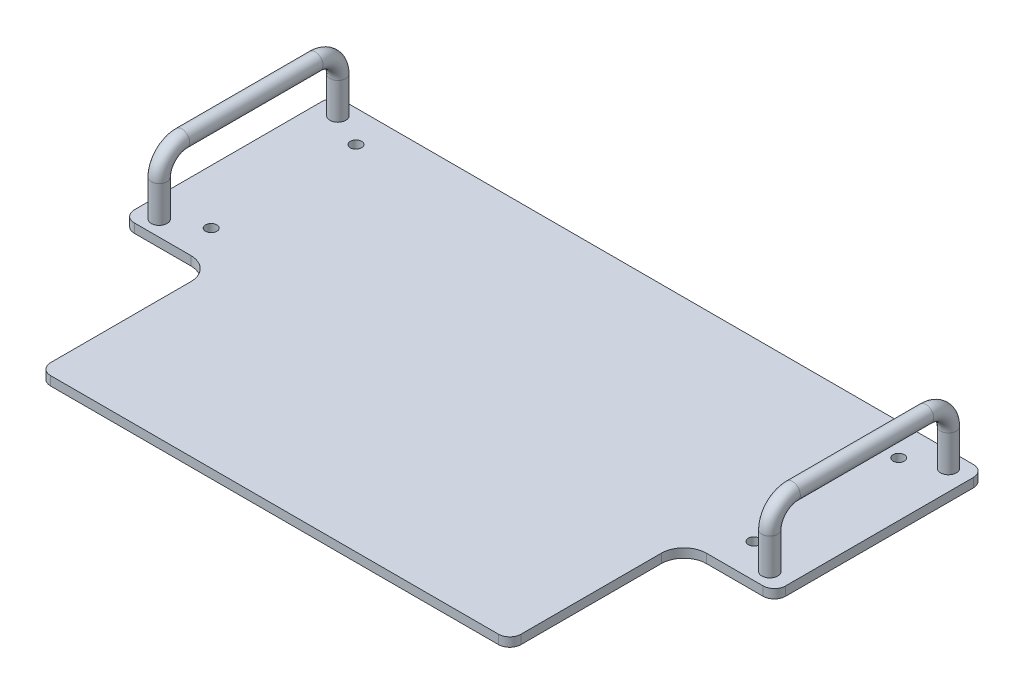
ISO-10303-21;
HEADER;
FILE_DESCRIPTION(('STEP AP214'),'2;1');
FILE_NAME('part.step','',(''),(''),'','','');
FILE_SCHEMA(('AUTOMOTIVE_DESIGN { 1 0 10303 214 1 1 1 1 }'));
ENDSEC;
DATA;
#1=APPLICATION_CONTEXT('core data for automotive mechanical design processes');
#2=APPLICATION_PROTOCOL_DEFINITION('international standard','automotive_design',2000,#1);
#3=PRODUCT_CONTEXT('',#1,'mechanical');
#4=PRODUCT('Part','Part','',(#3));
#5=PRODUCT_RELATED_PRODUCT_CATEGORY('part','',(#4));
#6=PRODUCT_DEFINITION_FORMATION('','',#4);
#7=PRODUCT_DEFINITION_CONTEXT('part definition',#1,'design');
#8=PRODUCT_DEFINITION('design','',#6,#7);
#9=PRODUCT_DEFINITION_SHAPE('','',#8);
#10=(LENGTH_UNIT() NAMED_UNIT(*) SI_UNIT(.MILLI.,.METRE.));
#11=(NAMED_UNIT(*) PLANE_ANGLE_UNIT() SI_UNIT($,.RADIAN.));
#12=(NAMED_UNIT(*) SI_UNIT($,.STERADIAN.) SOLID_ANGLE_UNIT());
#13=UNCERTAINTY_MEASURE_WITH_UNIT(LENGTH_MEASURE(1.E-05),#10,'distance_accuracy_value','');
#14=(GEOMETRIC_REPRESENTATION_CONTEXT(3) GLOBAL_UNCERTAINTY_ASSIGNED_CONTEXT((#13)) GLOBAL_UNIT_ASSIGNED_CONTEXT((#10,
#11,#12)) REPRESENTATION_CONTEXT('',''));
#15=CARTESIAN_POINT('',(0.,0.,0.));
#16=DIRECTION('',(0.,0.,1.));
#17=DIRECTION('',(1.,0.,0.));
#18=AXIS2_PLACEMENT_3D('',#15,#16,#17);
#19=CARTESIAN_POINT('',(-35.,4.,-165.));
#20=DIRECTION('',(0.,-1.,0.));
#21=DIRECTION('',(0.,0.,-1.));
#22=AXIS2_PLACEMENT_3D('',#19,#20,#21);
#23=CYLINDRICAL_SURFACE('',#22,5.);
#24=CARTESIAN_POINT('',(-35.,0.,-165.));
#25=DIRECTION('',(0.,-1.,0.));
#26=DIRECTION('',(0.,0.,-1.));
#27=AXIS2_PLACEMENT_3D('',#24,#25,#26);
#28=CIRCLE('',#27,5.);
#29=CARTESIAN_POINT('',(-40.,0.,-165.));
#30=VERTEX_POINT('',#29);
#31=CARTESIAN_POINT('',(-35.,0.,-170.));
#32=VERTEX_POINT('',#31);
#33=EDGE_CURVE('E206',#30,#32,#28,.T.);
#34=ORIENTED_EDGE('',*,*,#33,.F.);
#35=DIRECTION('',(0.,-1.,0.));
#36=VECTOR('',#35,1.);
#37=CARTESIAN_POINT('',(-40.,4.,-165.));
#38=LINE('',#37,#36);
#39=CARTESIAN_POINT('',(-40.,4.,-165.));
#40=VERTEX_POINT('',#39);
#41=EDGE_CURVE('E75',#40,#30,#38,.T.);
#42=ORIENTED_EDGE('',*,*,#41,.F.);
#43=CARTESIAN_POINT('',(-35.,4.,-165.));
#44=DIRECTION('',(0.,-1.,0.));
#45=DIRECTION('',(0.,0.,-1.));
#46=AXIS2_PLACEMENT_3D('',#43,#44,#45);
#47=CIRCLE('',#46,5.);
#48=CARTESIAN_POINT('',(-35.,4.,-170.));
#49=VERTEX_POINT('',#48);
#50=EDGE_CURVE('E245',#40,#49,#47,.T.);
#51=ORIENTED_EDGE('',*,*,#50,.T.);
#52=DIRECTION('',(0.,-1.,0.));
#53=VECTOR('',#52,1.);
#54=CARTESIAN_POINT('',(-35.,4.,-170.));
#55=LINE('',#54,#53);
#56=EDGE_CURVE('E140',#49,#32,#55,.T.);
#57=ORIENTED_EDGE('',*,*,#56,.T.);
#58=EDGE_LOOP('',(#34,#42,#51,#57));
#59=FACE_BOUND('',#58,.T.);
#60=ADVANCED_FACE('F57',(#59),#23,.T.);
#61=CARTESIAN_POINT('',(-40.,4.,-82.));
#62=DIRECTION('',(-1.,0.,0.));
#63=DIRECTION('',(0.,0.,1.));
#64=AXIS2_PLACEMENT_3D('',#61,#62,#63);
#65=PLANE('',#64);
#66=DIRECTION('',(0.,0.,-1.));
#67=VECTOR('',#66,1.);
#68=CARTESIAN_POINT('',(-40.,0.,-82.));
#69=LINE('',#68,#67);
#70=CARTESIAN_POINT('',(-40.,0.,-82.));
#71=VERTEX_POINT('',#70);
#72=EDGE_CURVE('E242',#71,#30,#69,.T.);
#73=ORIENTED_EDGE('',*,*,#72,.F.);
#74=DIRECTION('',(0.,-1.,0.));
#75=VECTOR('',#74,1.);
#76=CARTESIAN_POINT('',(-40.,4.,-82.));
#77=LINE('',#76,#75);
#78=CARTESIAN_POINT('',(-40.,4.,-82.));
#79=VERTEX_POINT('',#78);
#80=EDGE_CURVE('E128',#79,#71,#77,.T.);
#81=ORIENTED_EDGE('',*,*,#80,.F.);
#82=DIRECTION('',(0.,0.,-1.));
#83=VECTOR('',#82,1.);
#84=CARTESIAN_POINT('',(-40.,4.,-82.));
#85=LINE('',#84,#83);
#86=EDGE_CURVE('E196',#79,#40,#85,.T.);
#87=ORIENTED_EDGE('',*,*,#86,.T.);
#88=ORIENTED_EDGE('',*,*,#41,.T.);
#89=EDGE_LOOP('',(#73,#81,#87,#88));
#90=FACE_BOUND('',#89,.T.);
#91=ADVANCED_FACE('F415',(#90),#65,.T.);
#92=CARTESIAN_POINT('',(-35.,4.,-82.));
#93=DIRECTION('',(0.,-1.,0.));
#94=DIRECTION('',(0.,0.,-1.));
#95=AXIS2_PLACEMENT_3D('',#92,#93,#94);
#96=CYLINDRICAL_SURFACE('',#95,5.);
#97=CARTESIAN_POINT('',(-35.,0.,-82.));
#98=DIRECTION('',(0.,-1.,0.));
#99=DIRECTION('',(0.,0.,-1.));
#100=AXIS2_PLACEMENT_3D('',#97,#98,#99);
#101=CIRCLE('',#100,5.);
#102=CARTESIAN_POINT('',(-35.,0.,-77.));
#103=VERTEX_POINT('',#102);
#104=EDGE_CURVE('E183',#103,#71,#101,.T.);
#105=ORIENTED_EDGE('',*,*,#104,.F.);
#106=DIRECTION('',(0.,-1.,0.));
#107=VECTOR('',#106,1.);
#108=CARTESIAN_POINT('',(-35.,4.,-77.));
#109=LINE('',#108,#107);
#110=CARTESIAN_POINT('',(-35.,4.,-77.));
#111=VERTEX_POINT('',#110);
#112=EDGE_CURVE('E178',#111,#103,#109,.T.);
#113=ORIENTED_EDGE('',*,*,#112,.F.);
#114=CARTESIAN_POINT('',(-35.,4.,-82.));
#115=DIRECTION('',(0.,-1.,0.));
#116=DIRECTION('',(0.,0.,-1.));
#117=AXIS2_PLACEMENT_3D('',#114,#115,#116);
#118=CIRCLE('',#117,5.);
#119=EDGE_CURVE('E181',#111,#79,#118,.T.);
#120=ORIENTED_EDGE('',*,*,#119,.T.);
#121=ORIENTED_EDGE('',*,*,#80,.T.);
#122=EDGE_LOOP('',(#105,#113,#120,#121));
#123=FACE_BOUND('',#122,.T.);
#124=ADVANCED_FACE('F180',(#123),#96,.T.);
#125=CARTESIAN_POINT('',(-10.,4.,-77.));
#126=DIRECTION('',(0.,0.,1.));
#127=DIRECTION('',(1.,0.,0.));
#128=AXIS2_PLACEMENT_3D('',#125,#126,#127);
#129=PLANE('',#128);
#130=DIRECTION('',(-1.,0.,0.));
#131=VECTOR('',#130,1.);
#132=CARTESIAN_POINT('',(-10.,0.,-77.));
#133=LINE('',#132,#131);
#134=CARTESIAN_POINT('',(-10.,0.,-77.));
#135=VERTEX_POINT('',#134);
#136=EDGE_CURVE('E239',#135,#103,#133,.T.);
#137=ORIENTED_EDGE('',*,*,#136,.F.);
#138=DIRECTION('',(0.,-1.,0.));
#139=VECTOR('',#138,1.);
#140=CARTESIAN_POINT('',(-10.,4.,-77.));
#141=LINE('',#140,#139);
#142=CARTESIAN_POINT('',(-10.,4.,-77.));
#143=VERTEX_POINT('',#142);
#144=EDGE_CURVE('E188',#143,#135,#141,.T.);
#145=ORIENTED_EDGE('',*,*,#144,.F.);
#146=DIRECTION('',(-1.,0.,0.));
#147=VECTOR('',#146,1.);
#148=CARTESIAN_POINT('',(-10.,4.,-77.));
#149=LINE('',#148,#147);
#150=EDGE_CURVE('E194',#143,#111,#149,.T.);
#151=ORIENTED_EDGE('',*,*,#150,.T.);
#152=ORIENTED_EDGE('',*,*,#112,.T.);
#153=EDGE_LOOP('',(#137,#145,#151,#152));
#154=FACE_BOUND('',#153,.T.);
#155=ADVANCED_FACE('F198',(#154),#129,.T.);
#156=CARTESIAN_POINT('',(-10.,4.,-67.));
#157=DIRECTION('',(0.,-1.,0.));
#158=DIRECTION('',(0.,0.,-1.));
#159=AXIS2_PLACEMENT_3D('',#156,#157,#158);
#160=CYLINDRICAL_SURFACE('',#159,10.);
#161=CARTESIAN_POINT('',(-10.,0.,-67.));
#162=DIRECTION('',(0.,1.,0.));
#163=DIRECTION('',(0.,0.,1.));
#164=AXIS2_PLACEMENT_3D('',#161,#162,#163);
#165=CIRCLE('',#164,10.);
#166=CARTESIAN_POINT('',(0.,0.,-67.));
#167=VERTEX_POINT('',#166);
#168=EDGE_CURVE('E236',#167,#135,#165,.T.);
#169=ORIENTED_EDGE('',*,*,#168,.F.);
#170=DIRECTION('',(0.,-1.,0.));
#171=VECTOR('',#170,1.);
#172=CARTESIAN_POINT('',(0.,4.,-67.));
#173=LINE('',#172,#171);
#174=CARTESIAN_POINT('',(0.,4.,-67.));
#175=VERTEX_POINT('',#174);
#176=EDGE_CURVE('E250',#175,#167,#173,.T.);
#177=ORIENTED_EDGE('',*,*,#176,.F.);
#178=CARTESIAN_POINT('',(-10.,4.,-67.));
#179=DIRECTION('',(0.,1.,0.));
#180=DIRECTION('',(0.,0.,1.));
#181=AXIS2_PLACEMENT_3D('',#178,#179,#180);
#182=CIRCLE('',#181,10.);
#183=EDGE_CURVE('E199',#175,#143,#182,.T.);
#184=ORIENTED_EDGE('',*,*,#183,.T.);
#185=ORIENTED_EDGE('',*,*,#144,.T.);
#186=EDGE_LOOP('',(#169,#177,#184,#185));
#187=FACE_BOUND('',#186,.T.);
#188=ADVANCED_FACE('F422',(#187),#160,.F.);
#189=CARTESIAN_POINT('',(0.,4.,-5.));
#190=DIRECTION('',(-1.,0.,0.));
#191=DIRECTION('',(0.,0.,1.));
#192=AXIS2_PLACEMENT_3D('',#189,#190,#191);
#193=PLANE('',#192);
#194=DIRECTION('',(0.,0.,-1.));
#195=VECTOR('',#194,1.);
#196=CARTESIAN_POINT('',(0.,0.,-5.));
#197=LINE('',#196,#195);
#198=CARTESIAN_POINT('',(0.,0.,-5.));
#199=VERTEX_POINT('',#198);
#200=EDGE_CURVE('E233',#199,#167,#197,.T.);
#201=ORIENTED_EDGE('',*,*,#200,.F.);
#202=DIRECTION('',(0.,-1.,0.));
#203=VECTOR('',#202,1.);
#204=CARTESIAN_POINT('',(0.,4.,-5.));
#205=LINE('',#204,#203);
#206=CARTESIAN_POINT('',(0.,4.,-5.));
#207=VERTEX_POINT('',#206);
#208=EDGE_CURVE('E252',#207,#199,#205,.T.);
#209=ORIENTED_EDGE('',*,*,#208,.F.);
#210=DIRECTION('',(0.,0.,-1.));
#211=VECTOR('',#210,1.);
#212=CARTESIAN_POINT('',(0.,4.,-5.));
#213=LINE('',#212,#211);
#214=EDGE_CURVE('E201',#207,#175,#213,.T.);
#215=ORIENTED_EDGE('',*,*,#214,.T.);
#216=ORIENTED_EDGE('',*,*,#176,.T.);
#217=EDGE_LOOP('',(#201,#209,#215,#216));
#218=FACE_BOUND('',#217,.T.);
#219=ADVANCED_FACE('F357',(#218),#193,.T.);
#220=CARTESIAN_POINT('',(5.,4.,-5.));
#221=DIRECTION('',(0.,-1.,0.));
#222=DIRECTION('',(0.,0.,-1.));
#223=AXIS2_PLACEMENT_3D('',#220,#221,#222);
#224=CYLINDRICAL_SURFACE('',#223,5.);
#225=CARTESIAN_POINT('',(5.,0.,-5.));
#226=DIRECTION('',(0.,-1.,0.));
#227=DIRECTION('',(0.,0.,-1.));
#228=AXIS2_PLACEMENT_3D('',#225,#226,#227);
#229=CIRCLE('',#228,5.);
#230=CARTESIAN_POINT('',(5.,0.,0.));
#231=VERTEX_POINT('',#230);
#232=EDGE_CURVE('E230',#231,#199,#229,.T.);
#233=ORIENTED_EDGE('',*,*,#232,.F.);
#234=DIRECTION('',(0.,-1.,0.));
#235=VECTOR('',#234,1.);
#236=CARTESIAN_POINT('',(5.,4.,0.));
#237=LINE('',#236,#235);
#238=CARTESIAN_POINT('',(5.,4.,0.));
#239=VERTEX_POINT('',#238);
#240=EDGE_CURVE('E254',#239,#231,#237,.T.);
#241=ORIENTED_EDGE('',*,*,#240,.F.);
#242=CARTESIAN_POINT('',(5.,4.,-5.));
#243=DIRECTION('',(0.,-1.,0.));
#244=DIRECTION('',(0.,0.,-1.));
#245=AXIS2_PLACEMENT_3D('',#242,#243,#244);
#246=CIRCLE('',#245,5.);
#247=EDGE_CURVE('E351',#239,#207,#246,.T.);
#248=ORIENTED_EDGE('',*,*,#247,.T.);
#249=ORIENTED_EDGE('',*,*,#208,.T.);
#250=EDGE_LOOP('',(#233,#241,#248,#249));
#251=FACE_BOUND('',#250,.T.);
#252=ADVANCED_FACE('F362',(#251),#224,.T.);
#253=CARTESIAN_POINT('',(5.,4.,0.));
#254=DIRECTION('',(0.,0.,-1.));
#255=DIRECTION('',(-1.,0.,0.));
#256=AXIS2_PLACEMENT_3D('',#253,#254,#255);
#257=PLANE('',#256);
#258=DIRECTION('',(1.,0.,0.));
#259=VECTOR('',#258,1.);
#260=CARTESIAN_POINT('',(5.,0.,0.));
#261=LINE('',#260,#259);
#262=CARTESIAN_POINT('',(203.,0.,0.));
#263=VERTEX_POINT('',#262);
#264=EDGE_CURVE('E228',#231,#263,#261,.T.);
#265=ORIENTED_EDGE('',*,*,#264,.T.);
#266=DIRECTION('',(0.,-1.,0.));
#267=VECTOR('',#266,1.);
#268=CARTESIAN_POINT('',(203.,4.,0.));
#269=LINE('',#268,#267);
#270=CARTESIAN_POINT('',(203.,4.,0.));
#271=VERTEX_POINT('',#270);
#272=EDGE_CURVE('E256',#271,#263,#269,.T.);
#273=ORIENTED_EDGE('',*,*,#272,.F.);
#274=DIRECTION('',(1.,0.,0.));
#275=VECTOR('',#274,1.);
#276=CARTESIAN_POINT('',(5.,4.,0.));
#277=LINE('',#276,#275);
#278=EDGE_CURVE('E349',#239,#271,#277,.T.);
#279=ORIENTED_EDGE('',*,*,#278,.F.);
#280=ORIENTED_EDGE('',*,*,#240,.T.);
#281=EDGE_LOOP('',(#265,#273,#279,#280));
#282=FACE_BOUND('',#281,.T.);
#283=ADVANCED_FACE('F367',(#282),#257,.F.);
#284=CARTESIAN_POINT('',(203.,4.,-5.));
#285=DIRECTION('',(0.,-1.,0.));
#286=DIRECTION('',(0.,0.,-1.));
#287=AXIS2_PLACEMENT_3D('',#284,#285,#286);
#288=CYLINDRICAL_SURFACE('',#287,5.);
#289=CARTESIAN_POINT('',(203.,0.,-5.));
#290=DIRECTION('',(0.,1.,0.));
#291=DIRECTION('',(0.,0.,1.));
#292=AXIS2_PLACEMENT_3D('',#289,#290,#291);
#293=CIRCLE('',#292,5.);
#294=CARTESIAN_POINT('',(208.,0.,-5.));
#295=VERTEX_POINT('',#294);
#296=EDGE_CURVE('E226',#263,#295,#293,.T.);
#297=ORIENTED_EDGE('',*,*,#296,.T.);
#298=DIRECTION('',(0.,-1.,0.));
#299=VECTOR('',#298,1.);
#300=CARTESIAN_POINT('',(208.,4.,-5.));
#301=LINE('',#300,#299);
#302=CARTESIAN_POINT('',(208.,4.,-5.));
#303=VERTEX_POINT('',#302);
#304=EDGE_CURVE('E259',#303,#295,#301,.T.);
#305=ORIENTED_EDGE('',*,*,#304,.F.);
#306=CARTESIAN_POINT('',(203.,4.,-5.));
#307=DIRECTION('',(0.,1.,0.));
#308=DIRECTION('',(0.,0.,1.));
#309=AXIS2_PLACEMENT_3D('',#306,#307,#308);
#310=CIRCLE('',#309,5.);
#311=EDGE_CURVE('E347',#271,#303,#310,.T.);
#312=ORIENTED_EDGE('',*,*,#311,.F.);
#313=ORIENTED_EDGE('',*,*,#272,.T.);
#314=EDGE_LOOP('',(#297,#305,#312,#313));
#315=FACE_BOUND('',#314,.T.);
#316=ADVANCED_FACE('F373',(#315),#288,.T.);
#317=CARTESIAN_POINT('',(208.,4.,-5.));
#318=DIRECTION('',(-1.,0.,0.));
#319=DIRECTION('',(0.,0.,1.));
#320=AXIS2_PLACEMENT_3D('',#317,#318,#319);
#321=PLANE('',#320);
#322=DIRECTION('',(0.,0.,-1.));
#323=VECTOR('',#322,1.);
#324=CARTESIAN_POINT('',(208.,0.,-5.));
#325=LINE('',#324,#323);
#326=CARTESIAN_POINT('',(208.,0.,-67.));
#327=VERTEX_POINT('',#326);
#328=EDGE_CURVE('E224',#295,#327,#325,.T.);
#329=ORIENTED_EDGE('',*,*,#328,.T.);
#330=DIRECTION('',(0.,-1.,0.));
#331=VECTOR('',#330,1.);
#332=CARTESIAN_POINT('',(208.,4.,-67.));
#333=LINE('',#332,#331);
#334=CARTESIAN_POINT('',(208.,4.,-67.));
#335=VERTEX_POINT('',#334);
#336=EDGE_CURVE('E262',#335,#327,#333,.T.);
#337=ORIENTED_EDGE('',*,*,#336,.F.);
#338=DIRECTION('',(0.,0.,-1.));
#339=VECTOR('',#338,1.);
#340=CARTESIAN_POINT('',(208.,4.,-5.));
#341=LINE('',#340,#339);
#342=EDGE_CURVE('E345',#303,#335,#341,.T.);
#343=ORIENTED_EDGE('',*,*,#342,.F.);
#344=ORIENTED_EDGE('',*,*,#304,.T.);
#345=EDGE_LOOP('',(#329,#337,#343,#344));
#346=FACE_BOUND('',#345,.T.);
#347=ADVANCED_FACE('F377',(#346),#321,.F.);
#348=CARTESIAN_POINT('',(218.,4.,-67.));
#349=DIRECTION('',(0.,-1.,0.));
#350=DIRECTION('',(0.,0.,-1.));
#351=AXIS2_PLACEMENT_3D('',#348,#349,#350);
#352=CYLINDRICAL_SURFACE('',#351,9.99999999999999);
#353=CARTESIAN_POINT('',(218.,0.,-67.));
#354=DIRECTION('',(0.,-1.,0.));
#355=DIRECTION('',(0.,0.,-1.));
#356=AXIS2_PLACEMENT_3D('',#353,#354,#355);
#357=CIRCLE('',#356,9.99999999999999);
#358=CARTESIAN_POINT('',(218.,0.,-77.));
#359=VERTEX_POINT('',#358);
#360=EDGE_CURVE('E222',#327,#359,#357,.T.);
#361=ORIENTED_EDGE('',*,*,#360,.T.);
#362=DIRECTION('',(0.,-1.,0.));
#363=VECTOR('',#362,1.);
#364=CARTESIAN_POINT('',(218.,4.,-77.));
#365=LINE('',#364,#363);
#366=CARTESIAN_POINT('',(218.,4.,-77.));
#367=VERTEX_POINT('',#366);
#368=EDGE_CURVE('E265',#367,#359,#365,.T.);
#369=ORIENTED_EDGE('',*,*,#368,.F.);
#370=CARTESIAN_POINT('',(218.,4.,-67.));
#371=DIRECTION('',(0.,-1.,0.));
#372=DIRECTION('',(0.,0.,-1.));
#373=AXIS2_PLACEMENT_3D('',#370,#371,#372);
#374=CIRCLE('',#373,9.99999999999999);
#375=EDGE_CURVE('E343',#335,#367,#374,.T.);
#376=ORIENTED_EDGE('',*,*,#375,.F.);
#377=ORIENTED_EDGE('',*,*,#336,.T.);
#378=EDGE_LOOP('',(#361,#369,#376,#377));
#379=FACE_BOUND('',#378,.T.);
#380=ADVANCED_FACE('F382',(#379),#352,.F.);
#381=CARTESIAN_POINT('',(218.,4.,-77.));
#382=DIRECTION('',(0.,0.,-1.));
#383=DIRECTION('',(-1.,0.,0.));
#384=AXIS2_PLACEMENT_3D('',#381,#382,#383);
#385=PLANE('',#384);
#386=DIRECTION('',(1.,0.,0.));
#387=VECTOR('',#386,1.);
#388=CARTESIAN_POINT('',(218.,0.,-77.));
#389=LINE('',#388,#387);
#390=CARTESIAN_POINT('',(243.,0.,-77.));
#391=VERTEX_POINT('',#390);
#392=EDGE_CURVE('E220',#359,#391,#389,.T.);
#393=ORIENTED_EDGE('',*,*,#392,.T.);
#394=DIRECTION('',(0.,-1.,0.));
#395=VECTOR('',#394,1.);
#396=CARTESIAN_POINT('',(243.,4.,-77.));
#397=LINE('',#396,#395);
#398=CARTESIAN_POINT('',(243.,4.,-77.));
#399=VERTEX_POINT('',#398);
#400=EDGE_CURVE('E268',#399,#391,#397,.T.);
#401=ORIENTED_EDGE('',*,*,#400,.F.);
#402=DIRECTION('',(1.,0.,0.));
#403=VECTOR('',#402,1.);
#404=CARTESIAN_POINT('',(218.,4.,-77.));
#405=LINE('',#404,#403);
#406=EDGE_CURVE('E341',#367,#399,#405,.T.);
#407=ORIENTED_EDGE('',*,*,#406,.F.);
#408=ORIENTED_EDGE('',*,*,#368,.T.);
#409=EDGE_LOOP('',(#393,#401,#407,#408));
#410=FACE_BOUND('',#409,.T.);
#411=ADVANCED_FACE('F388',(#410),#385,.F.);
#412=CARTESIAN_POINT('',(243.,4.,-82.));
#413=DIRECTION('',(0.,-1.,0.));
#414=DIRECTION('',(0.,0.,-1.));
#415=AXIS2_PLACEMENT_3D('',#412,#413,#414);
#416=CYLINDRICAL_SURFACE('',#415,5.);
#417=CARTESIAN_POINT('',(243.,0.,-82.));
#418=DIRECTION('',(0.,1.,0.));
#419=DIRECTION('',(0.,0.,1.));
#420=AXIS2_PLACEMENT_3D('',#417,#418,#419);
#421=CIRCLE('',#420,5.);
#422=CARTESIAN_POINT('',(248.,0.,-82.));
#423=VERTEX_POINT('',#422);
#424=EDGE_CURVE('E218',#391,#423,#421,.T.);
#425=ORIENTED_EDGE('',*,*,#424,.T.);
#426=DIRECTION('',(0.,-1.,0.));
#427=VECTOR('',#426,1.);
#428=CARTESIAN_POINT('',(248.,4.,-82.));
#429=LINE('',#428,#427);
#430=CARTESIAN_POINT('',(248.,4.,-82.));
#431=VERTEX_POINT('',#430);
#432=EDGE_CURVE('E271',#431,#423,#429,.T.);
#433=ORIENTED_EDGE('',*,*,#432,.F.);
#434=CARTESIAN_POINT('',(243.,4.,-82.));
#435=DIRECTION('',(0.,1.,0.));
#436=DIRECTION('',(0.,0.,1.));
#437=AXIS2_PLACEMENT_3D('',#434,#435,#436);
#438=CIRCLE('',#437,5.);
#439=EDGE_CURVE('E339',#399,#431,#438,.T.);
#440=ORIENTED_EDGE('',*,*,#439,.F.);
#441=ORIENTED_EDGE('',*,*,#400,.T.);
#442=EDGE_LOOP('',(#425,#433,#440,#441));
#443=FACE_BOUND('',#442,.T.);
#444=ADVANCED_FACE('F392',(#443),#416,.T.);
#445=CARTESIAN_POINT('',(248.,4.,-82.));
#446=DIRECTION('',(-1.,0.,0.));
#447=DIRECTION('',(0.,0.,1.));
#448=AXIS2_PLACEMENT_3D('',#445,#446,#447);
#449=PLANE('',#448);
#450=DIRECTION('',(0.,0.,-1.));
#451=VECTOR('',#450,1.);
#452=CARTESIAN_POINT('',(248.,0.,-82.));
#453=LINE('',#452,#451);
#454=CARTESIAN_POINT('',(248.,0.,-165.));
#455=VERTEX_POINT('',#454);
#456=EDGE_CURVE('E216',#423,#455,#453,.T.);
#457=ORIENTED_EDGE('',*,*,#456,.T.);
#458=DIRECTION('',(0.,-1.,0.));
#459=VECTOR('',#458,1.);
#460=CARTESIAN_POINT('',(248.,4.,-165.));
#461=LINE('',#460,#459);
#462=CARTESIAN_POINT('',(248.,4.,-165.));
#463=VERTEX_POINT('',#462);
#464=EDGE_CURVE('E274',#463,#455,#461,.T.);
#465=ORIENTED_EDGE('',*,*,#464,.F.);
#466=DIRECTION('',(0.,0.,-1.));
#467=VECTOR('',#466,1.);
#468=CARTESIAN_POINT('',(248.,4.,-82.));
#469=LINE('',#468,#467);
#470=EDGE_CURVE('E337',#431,#463,#469,.T.);
#471=ORIENTED_EDGE('',*,*,#470,.F.);
#472=ORIENTED_EDGE('',*,*,#432,.T.);
#473=EDGE_LOOP('',(#457,#465,#471,#472));
#474=FACE_BOUND('',#473,.T.);
#475=ADVANCED_FACE('F397',(#474),#449,.F.);
#476=CARTESIAN_POINT('',(243.,4.,-165.));
#477=DIRECTION('',(0.,-1.,0.));
#478=DIRECTION('',(0.,0.,-1.));
#479=AXIS2_PLACEMENT_3D('',#476,#477,#478);
#480=CYLINDRICAL_SURFACE('',#479,5.);
#481=CARTESIAN_POINT('',(243.,0.,-165.));
#482=DIRECTION('',(0.,1.,0.));
#483=DIRECTION('',(0.,0.,1.));
#484=AXIS2_PLACEMENT_3D('',#481,#482,#483);
#485=CIRCLE('',#484,5.);
#486=CARTESIAN_POINT('',(243.,0.,-170.));
#487=VERTEX_POINT('',#486);
#488=EDGE_CURVE('E213',#455,#487,#485,.T.);
#489=ORIENTED_EDGE('',*,*,#488,.T.);
#490=DIRECTION('',(0.,-1.,0.));
#491=VECTOR('',#490,1.);
#492=CARTESIAN_POINT('',(243.,4.,-170.));
#493=LINE('',#492,#491);
#494=CARTESIAN_POINT('',(243.,4.,-170.));
#495=VERTEX_POINT('',#494);
#496=EDGE_CURVE('E277',#495,#487,#493,.T.);
#497=ORIENTED_EDGE('',*,*,#496,.F.);
#498=CARTESIAN_POINT('',(243.,4.,-165.));
#499=DIRECTION('',(0.,1.,0.));
#500=DIRECTION('',(0.,0.,1.));
#501=AXIS2_PLACEMENT_3D('',#498,#499,#500);
#502=CIRCLE('',#501,5.);
#503=EDGE_CURVE('E335',#463,#495,#502,.T.);
#504=ORIENTED_EDGE('',*,*,#503,.F.);
#505=ORIENTED_EDGE('',*,*,#464,.T.);
#506=EDGE_LOOP('',(#489,#497,#504,#505));
#507=FACE_BOUND('',#506,.T.);
#508=ADVANCED_FACE('F401',(#507),#480,.T.);
#509=CARTESIAN_POINT('',(-35.,4.,-170.));
#510=DIRECTION('',(0.,0.,-1.));
#511=DIRECTION('',(-1.,0.,0.));
#512=AXIS2_PLACEMENT_3D('',#509,#510,#511);
#513=PLANE('',#512);
#514=DIRECTION('',(1.,0.,0.));
#515=VECTOR('',#514,1.);
#516=CARTESIAN_POINT('',(-35.,0.,-170.));
#517=LINE('',#516,#515);
#518=EDGE_CURVE('E209',#32,#487,#517,.T.);
#519=ORIENTED_EDGE('',*,*,#518,.F.);
#520=ORIENTED_EDGE('',*,*,#56,.F.);
#521=DIRECTION('',(1.,0.,0.));
#522=VECTOR('',#521,1.);
#523=CARTESIAN_POINT('',(-35.,4.,-170.));
#524=LINE('',#523,#522);
#525=EDGE_CURVE('E333',#49,#495,#524,.T.);
#526=ORIENTED_EDGE('',*,*,#525,.T.);
#527=ORIENTED_EDGE('',*,*,#496,.T.);
#528=EDGE_LOOP('',(#519,#520,#526,#527));
#529=FACE_BOUND('',#528,.T.);
#530=ADVANCED_FACE('F403',(#529),#513,.T.);
#531=CARTESIAN_POINT('',(-35.,4.,-165.));
#532=DIRECTION('',(0.,-1.,0.));
#533=DIRECTION('',(0.,0.,-1.));
#534=AXIS2_PLACEMENT_3D('',#531,#532,#533);
#535=PLANE('',#534);
#536=CARTESIAN_POINT('',(224.,4.,-156.));
#537=DIRECTION('',(0.,1.,0.));
#538=DIRECTION('',(0.,0.,1.));
#539=AXIS2_PLACEMENT_3D('',#536,#537,#538);
#540=CIRCLE('',#539,2.5);
#541=CARTESIAN_POINT('',(224.,4.,-153.5));
#542=VERTEX_POINT('',#541);
#543=EDGE_CURVE('E295',#542,#542,#540,.T.);
#544=ORIENTED_EDGE('',*,*,#543,.F.);
#545=EDGE_LOOP('',(#544));
#546=FACE_BOUND('',#545,.T.);
#547=CARTESIAN_POINT('',(-16.,4.,-92.));
#548=DIRECTION('',(0.,1.,0.));
#549=DIRECTION('',(0.,0.,1.));
#550=AXIS2_PLACEMENT_3D('',#547,#548,#549);
#551=CIRCLE('',#550,2.5);
#552=CARTESIAN_POINT('',(-16.,4.,-89.5));
#553=VERTEX_POINT('',#552);
#554=EDGE_CURVE('E690',#553,#553,#551,.T.);
#555=ORIENTED_EDGE('',*,*,#554,.F.);
#556=EDGE_LOOP('',(#555));
#557=FACE_BOUND('',#556,.T.);
#558=CARTESIAN_POINT('',(224.,4.,-92.));
#559=DIRECTION('',(0.,1.,0.));
#560=DIRECTION('',(0.,0.,1.));
#561=AXIS2_PLACEMENT_3D('',#558,#559,#560);
#562=CIRCLE('',#561,2.5);
#563=CARTESIAN_POINT('',(224.,4.,-89.5));
#564=VERTEX_POINT('',#563);
#565=EDGE_CURVE('E308',#564,#564,#562,.T.);
#566=ORIENTED_EDGE('',*,*,#565,.F.);
#567=EDGE_LOOP('',(#566));
#568=FACE_BOUND('',#567,.T.);
#569=CARTESIAN_POINT('',(-16.,4.,-156.));
#570=DIRECTION('',(0.,1.,0.));
#571=DIRECTION('',(0.,0.,1.));
#572=AXIS2_PLACEMENT_3D('',#569,#570,#571);
#573=CIRCLE('',#572,2.5);
#574=CARTESIAN_POINT('',(-16.,4.,-153.5));
#575=VERTEX_POINT('',#574);
#576=EDGE_CURVE('E291',#575,#575,#573,.T.);
#577=ORIENTED_EDGE('',*,*,#576,.F.);
#578=EDGE_LOOP('',(#577));
#579=FACE_BOUND('',#578,.T.);
#580=CARTESIAN_POINT('',(-31.,4.,-163.));
#581=DIRECTION('',(0.,-1.,0.));
#582=DIRECTION('',(0.,0.,-1.));
#583=AXIS2_PLACEMENT_3D('',#580,#581,#582);
#584=CIRCLE('',#583,3.5);
#585=CARTESIAN_POINT('',(-31.,4.,-166.5));
#586=VERTEX_POINT('',#585);
#587=EDGE_CURVE('E12',#586,#586,#584,.F.);
#588=ORIENTED_EDGE('',*,*,#587,.F.);
#589=EDGE_LOOP('',(#588));
#590=FACE_BOUND('',#589,.T.);
#591=CARTESIAN_POINT('',(-31.,4.,-84.));
#592=DIRECTION('',(0.,-1.,0.));
#593=DIRECTION('',(0.,0.,-1.));
#594=AXIS2_PLACEMENT_3D('',#591,#592,#593);
#595=CIRCLE('',#594,3.5);
#596=CARTESIAN_POINT('',(-31.,4.,-87.5));
#597=VERTEX_POINT('',#596);
#598=EDGE_CURVE('E66',#597,#597,#595,.F.);
#599=ORIENTED_EDGE('',*,*,#598,.F.);
#600=EDGE_LOOP('',(#599));
#601=FACE_BOUND('',#600,.T.);
#602=CARTESIAN_POINT('',(239.,4.,-84.));
#603=DIRECTION('',(0.,-1.,0.));
#604=DIRECTION('',(0.,0.,-1.));
#605=AXIS2_PLACEMENT_3D('',#602,#603,#604);
#606=CIRCLE('',#605,3.5);
#607=CARTESIAN_POINT('',(239.,4.,-87.5));
#608=VERTEX_POINT('',#607);
#609=EDGE_CURVE('E282',#608,#608,#606,.F.);
#610=ORIENTED_EDGE('',*,*,#609,.F.);
#611=EDGE_LOOP('',(#610));
#612=FACE_BOUND('',#611,.T.);
#613=CARTESIAN_POINT('',(239.,4.,-163.));
#614=DIRECTION('',(0.,-1.,0.));
#615=DIRECTION('',(0.,0.,-1.));
#616=AXIS2_PLACEMENT_3D('',#613,#614,#615);
#617=CIRCLE('',#616,3.5);
#618=CARTESIAN_POINT('',(239.,4.,-166.5));
#619=VERTEX_POINT('',#618);
#620=EDGE_CURVE('E247',#619,#619,#617,.F.);
#621=ORIENTED_EDGE('',*,*,#620,.F.);
#622=EDGE_LOOP('',(#621));
#623=FACE_BOUND('',#622,.T.);
#624=ORIENTED_EDGE('',*,*,#50,.F.);
#625=ORIENTED_EDGE('',*,*,#86,.F.);
#626=ORIENTED_EDGE('',*,*,#119,.F.);
#627=ORIENTED_EDGE('',*,*,#150,.F.);
#628=ORIENTED_EDGE('',*,*,#183,.F.);
#629=ORIENTED_EDGE('',*,*,#214,.F.);
#630=ORIENTED_EDGE('',*,*,#247,.F.);
#631=ORIENTED_EDGE('',*,*,#278,.T.);
#632=ORIENTED_EDGE('',*,*,#311,.T.);
#633=ORIENTED_EDGE('',*,*,#342,.T.);
#634=ORIENTED_EDGE('',*,*,#375,.T.);
#635=ORIENTED_EDGE('',*,*,#406,.T.);
#636=ORIENTED_EDGE('',*,*,#439,.T.);
#637=ORIENTED_EDGE('',*,*,#470,.T.);
#638=ORIENTED_EDGE('',*,*,#503,.T.);
#639=ORIENTED_EDGE('',*,*,#525,.F.);
#640=EDGE_LOOP('',(#624,#625,#626,#627,#628,#629,#630,#631,#632,#633,#634,#635,#636,#637,#638,#639));
#641=FACE_BOUND('',#640,.T.);
#642=ADVANCED_FACE('F192',(#546,#557,#568,#579,#590,#601,#612,#623,#641),#535,.F.);
#643=CARTESIAN_POINT('',(-35.,0.,-165.));
#644=DIRECTION('',(0.,-1.,0.));
#645=DIRECTION('',(0.,0.,-1.));
#646=AXIS2_PLACEMENT_3D('',#643,#644,#645);
#647=PLANE('',#646);
#648=CARTESIAN_POINT('',(224.,0.,-156.));
#649=DIRECTION('',(0.,-1.,0.));
#650=DIRECTION('',(0.,0.,-1.));
#651=AXIS2_PLACEMENT_3D('',#648,#649,#650);
#652=CIRCLE('',#651,2.5);
#653=CARTESIAN_POINT('',(224.,0.,-158.5));
#654=VERTEX_POINT('',#653);
#655=EDGE_CURVE('E60',#654,#654,#652,.T.);
#656=ORIENTED_EDGE('',*,*,#655,.F.);
#657=EDGE_LOOP('',(#656));
#658=FACE_BOUND('',#657,.T.);
#659=CARTESIAN_POINT('',(-16.,0.,-92.));
#660=DIRECTION('',(0.,-1.,0.));
#661=DIRECTION('',(0.,0.,-1.));
#662=AXIS2_PLACEMENT_3D('',#659,#660,#661);
#663=CIRCLE('',#662,2.5);
#664=CARTESIAN_POINT('',(-16.,0.,-94.5));
#665=VERTEX_POINT('',#664);
#666=EDGE_CURVE('E294',#665,#665,#663,.T.);
#667=ORIENTED_EDGE('',*,*,#666,.F.);
#668=EDGE_LOOP('',(#667));
#669=FACE_BOUND('',#668,.T.);
#670=CARTESIAN_POINT('',(224.,0.,-92.));
#671=DIRECTION('',(0.,-1.,0.));
#672=DIRECTION('',(0.,0.,-1.));
#673=AXIS2_PLACEMENT_3D('',#670,#671,#672);
#674=CIRCLE('',#673,2.5);
#675=CARTESIAN_POINT('',(224.,0.,-94.5));
#676=VERTEX_POINT('',#675);
#677=EDGE_CURVE('E292',#676,#676,#674,.T.);
#678=ORIENTED_EDGE('',*,*,#677,.F.);
#679=EDGE_LOOP('',(#678));
#680=FACE_BOUND('',#679,.T.);
#681=CARTESIAN_POINT('',(-16.,0.,-156.));
#682=DIRECTION('',(0.,-1.,0.));
#683=DIRECTION('',(0.,0.,-1.));
#684=AXIS2_PLACEMENT_3D('',#681,#682,#683);
#685=CIRCLE('',#684,2.5);
#686=CARTESIAN_POINT('',(-16.,0.,-158.5));
#687=VERTEX_POINT('',#686);
#688=EDGE_CURVE('E287',#687,#687,#685,.T.);
#689=ORIENTED_EDGE('',*,*,#688,.F.);
#690=EDGE_LOOP('',(#689));
#691=FACE_BOUND('',#690,.T.);
#692=ORIENTED_EDGE('',*,*,#33,.T.);
#693=ORIENTED_EDGE('',*,*,#518,.T.);
#694=ORIENTED_EDGE('',*,*,#488,.F.);
#695=ORIENTED_EDGE('',*,*,#456,.F.);
#696=ORIENTED_EDGE('',*,*,#424,.F.);
#697=ORIENTED_EDGE('',*,*,#392,.F.);
#698=ORIENTED_EDGE('',*,*,#360,.F.);
#699=ORIENTED_EDGE('',*,*,#328,.F.);
#700=ORIENTED_EDGE('',*,*,#296,.F.);
#701=ORIENTED_EDGE('',*,*,#264,.F.);
#702=ORIENTED_EDGE('',*,*,#232,.T.);
#703=ORIENTED_EDGE('',*,*,#200,.T.);
#704=ORIENTED_EDGE('',*,*,#168,.T.);
#705=ORIENTED_EDGE('',*,*,#136,.T.);
#706=ORIENTED_EDGE('',*,*,#104,.T.);
#707=ORIENTED_EDGE('',*,*,#72,.T.);
#708=EDGE_LOOP('',(#692,#693,#694,#695,#696,#697,#698,#699,#700,#701,#702,#703,#704,#705,#706,#707));
#709=FACE_BOUND('',#708,.T.);
#710=ADVANCED_FACE('F410',(#658,#669,#680,#691,#709),#647,.T.);
#711=CARTESIAN_POINT('',(239.,4.,-84.));
#712=DIRECTION('',(0.,1.,0.));
#713=DIRECTION('',(0.,0.,1.));
#714=AXIS2_PLACEMENT_3D('',#711,#712,#713);
#715=CYLINDRICAL_SURFACE('',#714,3.5);
#716=CARTESIAN_POINT('',(239.,19.9999999999999,-84.));
#717=DIRECTION('',(0.,-1.,0.));
#718=DIRECTION('',(0.,0.,-1.));
#719=AXIS2_PLACEMENT_3D('',#716,#717,#718);
#720=CIRCLE('',#719,3.5);
#721=CARTESIAN_POINT('',(239.,19.9999999999999,-80.5));
#722=VERTEX_POINT('',#721);
#723=EDGE_CURVE('E321',#722,#722,#720,.T.);
#724=ORIENTED_EDGE('',*,*,#723,.T.);
#725=EDGE_LOOP('',(#724));
#726=FACE_BOUND('',#725,.T.);
#727=ORIENTED_EDGE('',*,*,#609,.T.);
#728=EDGE_LOOP('',(#727));
#729=FACE_BOUND('',#728,.T.);
#730=ADVANCED_FACE('F466',(#726,#729),#715,.T.);
#731=CARTESIAN_POINT('',(239.,20.,-94.));
#732=DIRECTION('',(-1.,0.,0.));
#733=DIRECTION('',(0.,0.,1.));
#734=AXIS2_PLACEMENT_3D('',#731,#732,#733);
#735=TOROIDAL_SURFACE('',#734,10.,3.5);
#736=CARTESIAN_POINT('',(239.,30.,-94.0000000000001));
#737=DIRECTION('',(0.,0.,1.));
#738=DIRECTION('',(0.,-1.,0.));
#739=AXIS2_PLACEMENT_3D('',#736,#737,#738);
#740=CIRCLE('',#739,3.5);
#741=CARTESIAN_POINT('',(239.,33.5,-94.0000000000001));
#742=VERTEX_POINT('',#741);
#743=EDGE_CURVE('E324',#742,#742,#740,.T.);
#744=CARTESIAN_POINT('',(239.,20.,-94.));
#745=DIRECTION('',(-1.,0.,0.));
#746=DIRECTION('',(0.,0.,1.));
#747=AXIS2_PLACEMENT_3D('',#744,#745,#746);
#748=CIRCLE('',#747,13.5);
#749=EDGE_CURVE('',#722,#742,#748,.T.);
#750=ORIENTED_EDGE('',*,*,#723,.F.);
#751=ORIENTED_EDGE('',*,*,#743,.T.);
#752=ORIENTED_EDGE('',*,*,#749,.T.);
#753=ORIENTED_EDGE('',*,*,#749,.F.);
#754=EDGE_LOOP('',(#750,#752,#751,#753));
#755=FACE_BOUND('',#754,.T.);
#756=ADVANCED_FACE('F471',(#755),#735,.T.);
#757=CARTESIAN_POINT('',(239.,30.,-94.0000000000001));
#758=DIRECTION('',(0.,0.,-1.));
#759=DIRECTION('',(-1.,0.,0.));
#760=AXIS2_PLACEMENT_3D('',#757,#758,#759);
#761=CYLINDRICAL_SURFACE('',#760,3.5);
#762=CARTESIAN_POINT('',(239.,30.,-153.));
#763=DIRECTION('',(0.,0.,1.));
#764=DIRECTION('',(0.,-1.,0.));
#765=AXIS2_PLACEMENT_3D('',#762,#763,#764);
#766=CIRCLE('',#765,3.5);
#767=CARTESIAN_POINT('',(239.,33.5,-153.));
#768=VERTEX_POINT('',#767);
#769=EDGE_CURVE('E327',#768,#768,#766,.T.);
#770=ORIENTED_EDGE('',*,*,#769,.T.);
#771=EDGE_LOOP('',(#770));
#772=FACE_BOUND('',#771,.T.);
#773=ORIENTED_EDGE('',*,*,#743,.F.);
#774=EDGE_LOOP('',(#773));
#775=FACE_BOUND('',#774,.T.);
#776=ADVANCED_FACE('F484',(#772,#775),#761,.T.);
#777=CARTESIAN_POINT('',(239.,20.,-153.));
#778=DIRECTION('',(-1.,0.,0.));
#779=DIRECTION('',(0.,0.,1.));
#780=AXIS2_PLACEMENT_3D('',#777,#778,#779);
#781=TOROIDAL_SURFACE('',#780,10.,3.5);
#782=CARTESIAN_POINT('',(239.,20.000000000001,-163.));
#783=DIRECTION('',(0.,1.,0.));
#784=DIRECTION('',(0.,0.,1.));
#785=AXIS2_PLACEMENT_3D('',#782,#783,#784);
#786=CIRCLE('',#785,3.5);
#787=CARTESIAN_POINT('',(239.,20.0000000000014,-166.5));
#788=VERTEX_POINT('',#787);
#789=EDGE_CURVE('E210',#788,#788,#786,.T.);
#790=CARTESIAN_POINT('',(239.,20.,-153.));
#791=DIRECTION('',(-1.,0.,0.));
#792=DIRECTION('',(0.,0.,1.));
#793=AXIS2_PLACEMENT_3D('',#790,#791,#792);
#794=CIRCLE('',#793,13.5);
#795=EDGE_CURVE('',#768,#788,#794,.T.);
#796=ORIENTED_EDGE('',*,*,#769,.F.);
#797=ORIENTED_EDGE('',*,*,#789,.T.);
#798=ORIENTED_EDGE('',*,*,#795,.T.);
#799=ORIENTED_EDGE('',*,*,#795,.F.);
#800=EDGE_LOOP('',(#796,#798,#797,#799));
#801=FACE_BOUND('',#800,.T.);
#802=ADVANCED_FACE('F494',(#801),#781,.T.);
#803=CARTESIAN_POINT('',(239.,19.9999999999999,-163.));
#804=DIRECTION('',(0.,-1.,0.));
#805=DIRECTION('',(0.,0.,-1.));
#806=AXIS2_PLACEMENT_3D('',#803,#804,#805);
#807=CYLINDRICAL_SURFACE('',#806,3.5);
#808=ORIENTED_EDGE('',*,*,#620,.T.);
#809=EDGE_LOOP('',(#808));
#810=FACE_BOUND('',#809,.T.);
#811=ORIENTED_EDGE('',*,*,#789,.F.);
#812=EDGE_LOOP('',(#811));
#813=FACE_BOUND('',#812,.T.);
#814=ADVANCED_FACE('F504',(#810,#813),#807,.T.);
#815=CARTESIAN_POINT('',(-31.,4.,-163.));
#816=DIRECTION('',(0.,1.,0.));
#817=DIRECTION('',(0.,0.,1.));
#818=AXIS2_PLACEMENT_3D('',#815,#816,#817);
#819=CYLINDRICAL_SURFACE('',#818,3.5);
#820=CARTESIAN_POINT('',(-31.,19.9999999999999,-163.));
#821=DIRECTION('',(0.,-1.,0.));
#822=DIRECTION('',(0.,0.,-1.));
#823=AXIS2_PLACEMENT_3D('',#820,#821,#822);
#824=CIRCLE('',#823,3.5);
#825=CARTESIAN_POINT('',(-31.,19.9999999999999,-166.5));
#826=VERTEX_POINT('',#825);
#827=EDGE_CURVE('E290',#826,#826,#824,.T.);
#828=ORIENTED_EDGE('',*,*,#827,.T.);
#829=EDGE_LOOP('',(#828));
#830=FACE_BOUND('',#829,.T.);
#831=ORIENTED_EDGE('',*,*,#587,.T.);
#832=EDGE_LOOP('',(#831));
#833=FACE_BOUND('',#832,.T.);
#834=ADVANCED_FACE('F514',(#830,#833),#819,.T.);
#835=CARTESIAN_POINT('',(-31.,20.,-153.));
#836=DIRECTION('',(1.,0.,0.));
#837=DIRECTION('',(0.,0.,-1.));
#838=AXIS2_PLACEMENT_3D('',#835,#836,#837);
#839=TOROIDAL_SURFACE('',#838,10.,3.5);
#840=CARTESIAN_POINT('',(-31.,30.,-153.));
#841=DIRECTION('',(0.,0.,-1.));
#842=DIRECTION('',(0.,1.,0.));
#843=AXIS2_PLACEMENT_3D('',#840,#841,#842);
#844=CIRCLE('',#843,3.5);
#845=CARTESIAN_POINT('',(-31.,33.5,-153.));
#846=VERTEX_POINT('',#845);
#847=EDGE_CURVE('E312',#846,#846,#844,.T.);
#848=CARTESIAN_POINT('',(-31.,20.,-153.));
#849=DIRECTION('',(1.,0.,0.));
#850=DIRECTION('',(0.,0.,-1.));
#851=AXIS2_PLACEMENT_3D('',#848,#849,#850);
#852=CIRCLE('',#851,13.5);
#853=EDGE_CURVE('',#826,#846,#852,.T.);
#854=ORIENTED_EDGE('',*,*,#827,.F.);
#855=ORIENTED_EDGE('',*,*,#847,.T.);
#856=ORIENTED_EDGE('',*,*,#853,.T.);
#857=ORIENTED_EDGE('',*,*,#853,.F.);
#858=EDGE_LOOP('',(#854,#856,#855,#857));
#859=FACE_BOUND('',#858,.T.);
#860=ADVANCED_FACE('F524',(#859),#839,.T.);
#861=CARTESIAN_POINT('',(-31.,30.,-153.));
#862=DIRECTION('',(0.,0.,1.));
#863=DIRECTION('',(1.,0.,0.));
#864=AXIS2_PLACEMENT_3D('',#861,#862,#863);
#865=CYLINDRICAL_SURFACE('',#864,3.5);
#866=CARTESIAN_POINT('',(-31.,30.,-94.0000000000001));
#867=DIRECTION('',(0.,0.,-1.));
#868=DIRECTION('',(0.,1.,0.));
#869=AXIS2_PLACEMENT_3D('',#866,#867,#868);
#870=CIRCLE('',#869,3.5);
#871=CARTESIAN_POINT('',(-31.,33.5,-94.0000000000001));
#872=VERTEX_POINT('',#871);
#873=EDGE_CURVE('E315',#872,#872,#870,.T.);
#874=ORIENTED_EDGE('',*,*,#873,.T.);
#875=EDGE_LOOP('',(#874));
#876=FACE_BOUND('',#875,.T.);
#877=ORIENTED_EDGE('',*,*,#847,.F.);
#878=EDGE_LOOP('',(#877));
#879=FACE_BOUND('',#878,.T.);
#880=ADVANCED_FACE('F535',(#876,#879),#865,.T.);
#881=CARTESIAN_POINT('',(-31.,20.,-94.));
#882=DIRECTION('',(1.,0.,0.));
#883=DIRECTION('',(0.,0.,-1.));
#884=AXIS2_PLACEMENT_3D('',#881,#882,#883);
#885=TOROIDAL_SURFACE('',#884,10.,3.5);
#886=CARTESIAN_POINT('',(-31.,19.9999999999994,-84.));
#887=DIRECTION('',(0.,1.,0.));
#888=DIRECTION('',(0.,0.,1.));
#889=AXIS2_PLACEMENT_3D('',#886,#887,#888);
#890=CIRCLE('',#889,3.5);
#891=CARTESIAN_POINT('',(-31.,19.9999999999992,-80.5));
#892=VERTEX_POINT('',#891);
#893=EDGE_CURVE('E318',#892,#892,#890,.T.);
#894=CARTESIAN_POINT('',(-31.,20.,-94.));
#895=DIRECTION('',(1.,0.,0.));
#896=DIRECTION('',(0.,0.,-1.));
#897=AXIS2_PLACEMENT_3D('',#894,#895,#896);
#898=CIRCLE('',#897,13.5);
#899=EDGE_CURVE('',#872,#892,#898,.T.);
#900=ORIENTED_EDGE('',*,*,#873,.F.);
#901=ORIENTED_EDGE('',*,*,#893,.T.);
#902=ORIENTED_EDGE('',*,*,#899,.T.);
#903=ORIENTED_EDGE('',*,*,#899,.F.);
#904=EDGE_LOOP('',(#900,#902,#901,#903));
#905=FACE_BOUND('',#904,.T.);
#906=ADVANCED_FACE('F545',(#905),#885,.T.);
#907=CARTESIAN_POINT('',(-31.,19.9999999999999,-84.));
#908=DIRECTION('',(0.,-1.,0.));
#909=DIRECTION('',(0.,0.,-1.));
#910=AXIS2_PLACEMENT_3D('',#907,#908,#909);
#911=CYLINDRICAL_SURFACE('',#910,3.5);
#912=ORIENTED_EDGE('',*,*,#598,.T.);
#913=EDGE_LOOP('',(#912));
#914=FACE_BOUND('',#913,.T.);
#915=ORIENTED_EDGE('',*,*,#893,.F.);
#916=EDGE_LOOP('',(#915));
#917=FACE_BOUND('',#916,.T.);
#918=ADVANCED_FACE('F474',(#914,#917),#911,.T.);
#919=CARTESIAN_POINT('',(-16.,-6.,-156.));
#920=DIRECTION('',(0.,1.,0.));
#921=DIRECTION('',(0.,0.,1.));
#922=AXIS2_PLACEMENT_3D('',#919,#920,#921);
#923=CYLINDRICAL_SURFACE('',#922,2.5);
#924=ORIENTED_EDGE('',*,*,#688,.T.);
#925=EDGE_LOOP('',(#924));
#926=FACE_BOUND('',#925,.T.);
#927=ORIENTED_EDGE('',*,*,#576,.T.);
#928=EDGE_LOOP('',(#927));
#929=FACE_BOUND('',#928,.T.);
#930=ADVANCED_FACE('F527',(#926,#929),#923,.F.);
#931=CARTESIAN_POINT('',(224.,-6.,-92.));
#932=DIRECTION('',(0.,1.,0.));
#933=DIRECTION('',(0.,0.,1.));
#934=AXIS2_PLACEMENT_3D('',#931,#932,#933);
#935=CYLINDRICAL_SURFACE('',#934,2.5);
#936=ORIENTED_EDGE('',*,*,#677,.T.);
#937=EDGE_LOOP('',(#936));
#938=FACE_BOUND('',#937,.T.);
#939=ORIENTED_EDGE('',*,*,#565,.T.);
#940=EDGE_LOOP('',(#939));
#941=FACE_BOUND('',#940,.T.);
#942=ADVANCED_FACE('F580',(#938,#941),#935,.F.);
#943=CARTESIAN_POINT('',(-16.,-6.,-92.));
#944=DIRECTION('',(0.,1.,0.));
#945=DIRECTION('',(0.,0.,1.));
#946=AXIS2_PLACEMENT_3D('',#943,#944,#945);
#947=CYLINDRICAL_SURFACE('',#946,2.5);
#948=ORIENTED_EDGE('',*,*,#666,.T.);
#949=EDGE_LOOP('',(#948));
#950=FACE_BOUND('',#949,.T.);
#951=ORIENTED_EDGE('',*,*,#554,.T.);
#952=EDGE_LOOP('',(#951));
#953=FACE_BOUND('',#952,.T.);
#954=ADVANCED_FACE('F590',(#950,#953),#947,.F.);
#955=CARTESIAN_POINT('',(224.,-6.,-156.));
#956=DIRECTION('',(0.,1.,0.));
#957=DIRECTION('',(0.,0.,1.));
#958=AXIS2_PLACEMENT_3D('',#955,#956,#957);
#959=CYLINDRICAL_SURFACE('',#958,2.5);
#960=ORIENTED_EDGE('',*,*,#655,.T.);
#961=EDGE_LOOP('',(#960));
#962=FACE_BOUND('',#961,.T.);
#963=ORIENTED_EDGE('',*,*,#543,.T.);
#964=EDGE_LOOP('',(#963));
#965=FACE_BOUND('',#964,.T.);
#966=ADVANCED_FACE('F600',(#962,#965),#959,.F.);
#967=CLOSED_SHELL('',(#60,#91,#124,#155,#188,#219,#252,#283,#316,#347,#380,#411,#444,#475,#508,
#530,#642,#710,#730,#756,#776,#802,#814,#834,#860,#880,#906,#918,#930,#942,#954,#966));
#968=MANIFOLD_SOLID_BREP('B2',#967);
#969=ADVANCED_BREP_SHAPE_REPRESENTATION('',(#18,#968),#14);
#970=SHAPE_DEFINITION_REPRESENTATION(#9,#969);
ENDSEC;
END-ISO-10303-21;
